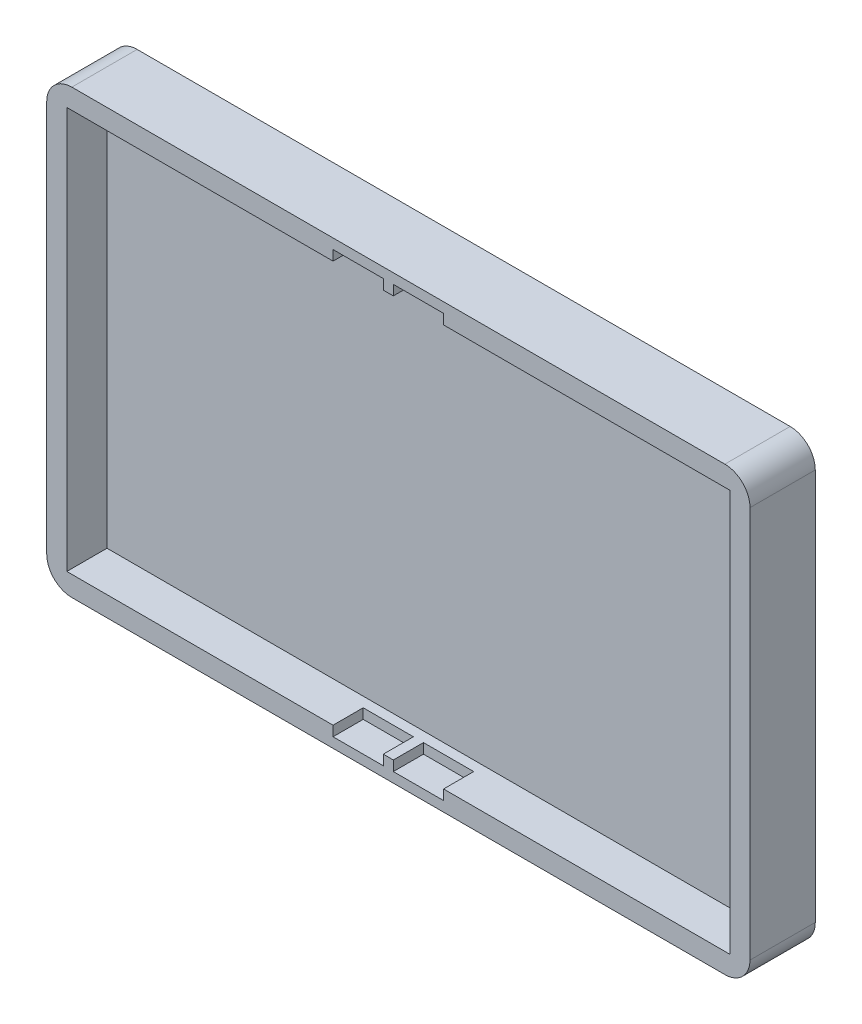
ISO-10303-21;
HEADER;
FILE_DESCRIPTION(('STEP AP214'),'2;1');
FILE_NAME('part.step','',(''),(''),'','','');
FILE_SCHEMA(('AUTOMOTIVE_DESIGN { 1 0 10303 214 1 1 1 1 }'));
ENDSEC;
DATA;
#1=APPLICATION_CONTEXT('core data for automotive mechanical design processes');
#2=APPLICATION_PROTOCOL_DEFINITION('international standard','automotive_design',2000,#1);
#3=PRODUCT_CONTEXT('',#1,'mechanical');
#4=PRODUCT('Part','Part','',(#3));
#5=PRODUCT_RELATED_PRODUCT_CATEGORY('part','',(#4));
#6=PRODUCT_DEFINITION_FORMATION('','',#4);
#7=PRODUCT_DEFINITION_CONTEXT('part definition',#1,'design');
#8=PRODUCT_DEFINITION('design','',#6,#7);
#9=PRODUCT_DEFINITION_SHAPE('','',#8);
#10=(LENGTH_UNIT() NAMED_UNIT(*) SI_UNIT(.MILLI.,.METRE.));
#11=(NAMED_UNIT(*) PLANE_ANGLE_UNIT() SI_UNIT($,.RADIAN.));
#12=(NAMED_UNIT(*) SI_UNIT($,.STERADIAN.) SOLID_ANGLE_UNIT());
#13=UNCERTAINTY_MEASURE_WITH_UNIT(LENGTH_MEASURE(1.E-05),#10,'distance_accuracy_value','');
#14=(GEOMETRIC_REPRESENTATION_CONTEXT(3) GLOBAL_UNCERTAINTY_ASSIGNED_CONTEXT((#13)) GLOBAL_UNIT_ASSIGNED_CONTEXT((#10,
#11,#12)) REPRESENTATION_CONTEXT('',''));
#15=CARTESIAN_POINT('',(0.,0.,0.));
#16=DIRECTION('',(0.,0.,1.));
#17=DIRECTION('',(1.,0.,0.));
#18=AXIS2_PLACEMENT_3D('',#15,#16,#17);
#19=CARTESIAN_POINT('',(68.,2.,2.5));
#20=DIRECTION('',(0.,-1.,0.));
#21=DIRECTION('',(1.,0.,0.));
#22=AXIS2_PLACEMENT_3D('',#19,#20,#21);
#23=PLANE('',#22);
#24=DIRECTION('',(1.,0.,0.));
#25=VECTOR('',#24,1.);
#26=CARTESIAN_POINT('',(68.,2.,6.5));
#27=LINE('',#26,#25);
#28=CARTESIAN_POINT('',(33.5,2.,6.5));
#29=VERTEX_POINT('',#28);
#30=CARTESIAN_POINT('',(34.5,2.,6.5));
#31=VERTEX_POINT('',#30);
#32=EDGE_CURVE('E406',#29,#31,#27,.T.);
#33=ORIENTED_EDGE('',*,*,#32,.T.);
#34=DIRECTION('',(0.,0.,1.));
#35=VECTOR('',#34,1.);
#36=CARTESIAN_POINT('',(34.5,2.,2.5));
#37=LINE('',#36,#35);
#38=CARTESIAN_POINT('',(34.5,2.,3.5));
#39=VERTEX_POINT('',#38);
#40=EDGE_CURVE('E358',#39,#31,#37,.T.);
#41=ORIENTED_EDGE('',*,*,#40,.F.);
#42=DIRECTION('',(-1.,0.,0.));
#43=VECTOR('',#42,1.);
#44=CARTESIAN_POINT('',(68.,2.,3.5));
#45=LINE('',#44,#43);
#46=CARTESIAN_POINT('',(39.5,2.,3.5));
#47=VERTEX_POINT('',#46);
#48=EDGE_CURVE('E355',#47,#39,#45,.T.);
#49=ORIENTED_EDGE('',*,*,#48,.F.);
#50=DIRECTION('',(0.,0.,-1.));
#51=VECTOR('',#50,1.);
#52=CARTESIAN_POINT('',(39.5,2.,2.5));
#53=LINE('',#52,#51);
#54=CARTESIAN_POINT('',(39.5,2.,6.5));
#55=VERTEX_POINT('',#54);
#56=EDGE_CURVE('E324',#55,#47,#53,.T.);
#57=ORIENTED_EDGE('',*,*,#56,.F.);
#58=CARTESIAN_POINT('',(68.,2.,6.5));
#59=VERTEX_POINT('',#58);
#60=EDGE_CURVE('E402',#55,#59,#27,.T.);
#61=ORIENTED_EDGE('',*,*,#60,.T.);
#62=DIRECTION('',(0.,0.,1.));
#63=VECTOR('',#62,1.);
#64=CARTESIAN_POINT('',(68.,2.,2.5));
#65=LINE('',#64,#63);
#66=CARTESIAN_POINT('',(68.,2.,2.5));
#67=VERTEX_POINT('',#66);
#68=EDGE_CURVE('E407',#67,#59,#65,.T.);
#69=ORIENTED_EDGE('',*,*,#68,.F.);
#70=DIRECTION('',(1.,0.,0.));
#71=VECTOR('',#70,1.);
#72=CARTESIAN_POINT('',(68.,2.,2.5));
#73=LINE('',#72,#71);
#74=CARTESIAN_POINT('',(2.,1.99999999999999,2.5));
#75=VERTEX_POINT('',#74);
#76=EDGE_CURVE('E385',#75,#67,#73,.T.);
#77=ORIENTED_EDGE('',*,*,#76,.F.);
#78=DIRECTION('',(0.,0.,1.));
#79=VECTOR('',#78,1.);
#80=CARTESIAN_POINT('',(2.,1.99999999999999,2.5));
#81=LINE('',#80,#79);
#82=CARTESIAN_POINT('',(2.,1.99999999999999,6.5));
#83=VERTEX_POINT('',#82);
#84=EDGE_CURVE('E412',#75,#83,#81,.T.);
#85=ORIENTED_EDGE('',*,*,#84,.T.);
#86=CARTESIAN_POINT('',(28.5,2.,6.5));
#87=VERTEX_POINT('',#86);
#88=EDGE_CURVE('E377',#83,#87,#27,.T.);
#89=ORIENTED_EDGE('',*,*,#88,.T.);
#90=DIRECTION('',(0.,0.,1.));
#91=VECTOR('',#90,1.);
#92=CARTESIAN_POINT('',(28.5,2.,2.5));
#93=LINE('',#92,#91);
#94=CARTESIAN_POINT('',(28.5,2.,3.5));
#95=VERTEX_POINT('',#94);
#96=EDGE_CURVE('E364',#95,#87,#93,.T.);
#97=ORIENTED_EDGE('',*,*,#96,.F.);
#98=DIRECTION('',(-1.,0.,0.));
#99=VECTOR('',#98,1.);
#100=CARTESIAN_POINT('',(68.,2.,3.50000000000001));
#101=LINE('',#100,#99);
#102=CARTESIAN_POINT('',(33.5,2.,3.5));
#103=VERTEX_POINT('',#102);
#104=EDGE_CURVE('E361',#103,#95,#101,.T.);
#105=ORIENTED_EDGE('',*,*,#104,.F.);
#106=DIRECTION('',(0.,0.,-1.));
#107=VECTOR('',#106,1.);
#108=CARTESIAN_POINT('',(33.5,2.,2.5));
#109=LINE('',#108,#107);
#110=EDGE_CURVE('E367',#29,#103,#109,.T.);
#111=ORIENTED_EDGE('',*,*,#110,.F.);
#112=EDGE_LOOP('',(#33,#41,#49,#57,#61,#69,#77,#85,#89,#97,#105,#111));
#113=FACE_BOUND('',#112,.T.);
#114=ADVANCED_FACE('F43',(#113),#23,.F.);
#115=CARTESIAN_POINT('',(68.,42.,2.5));
#116=DIRECTION('',(0.,1.,0.));
#117=DIRECTION('',(-1.,0.,0.));
#118=AXIS2_PLACEMENT_3D('',#115,#116,#117);
#119=PLANE('',#118);
#120=DIRECTION('',(0.,0.,-1.));
#121=VECTOR('',#120,1.);
#122=CARTESIAN_POINT('',(28.5,42.,2.5));
#123=LINE('',#122,#121);
#124=CARTESIAN_POINT('',(28.5,42.,6.5));
#125=VERTEX_POINT('',#124);
#126=CARTESIAN_POINT('',(28.5,42.,3.5));
#127=VERTEX_POINT('',#126);
#128=EDGE_CURVE('E463',#125,#127,#123,.T.);
#129=ORIENTED_EDGE('',*,*,#128,.F.);
#130=DIRECTION('',(-1.,0.,0.));
#131=VECTOR('',#130,1.);
#132=CARTESIAN_POINT('',(68.,42.,6.5));
#133=LINE('',#132,#131);
#134=CARTESIAN_POINT('',(2.,42.,6.5));
#135=VERTEX_POINT('',#134);
#136=EDGE_CURVE('E392',#125,#135,#133,.T.);
#137=ORIENTED_EDGE('',*,*,#136,.T.);
#138=DIRECTION('',(0.,0.,1.));
#139=VECTOR('',#138,1.);
#140=CARTESIAN_POINT('',(2.,42.,2.5));
#141=LINE('',#140,#139);
#142=CARTESIAN_POINT('',(2.,42.,2.5));
#143=VERTEX_POINT('',#142);
#144=EDGE_CURVE('E415',#143,#135,#141,.T.);
#145=ORIENTED_EDGE('',*,*,#144,.F.);
#146=DIRECTION('',(-1.,0.,0.));
#147=VECTOR('',#146,1.);
#148=CARTESIAN_POINT('',(68.,42.,2.5));
#149=LINE('',#148,#147);
#150=CARTESIAN_POINT('',(68.,42.,2.5));
#151=VERTEX_POINT('',#150);
#152=EDGE_CURVE('E376',#151,#143,#149,.T.);
#153=ORIENTED_EDGE('',*,*,#152,.F.);
#154=DIRECTION('',(0.,0.,1.));
#155=VECTOR('',#154,1.);
#156=CARTESIAN_POINT('',(68.,42.,2.5));
#157=LINE('',#156,#155);
#158=CARTESIAN_POINT('',(68.,42.,6.5));
#159=VERTEX_POINT('',#158);
#160=EDGE_CURVE('E389',#151,#159,#157,.T.);
#161=ORIENTED_EDGE('',*,*,#160,.T.);
#162=CARTESIAN_POINT('',(39.5,42.,6.5));
#163=VERTEX_POINT('',#162);
#164=EDGE_CURVE('E393',#159,#163,#133,.T.);
#165=ORIENTED_EDGE('',*,*,#164,.T.);
#166=DIRECTION('',(0.,0.,1.));
#167=VECTOR('',#166,1.);
#168=CARTESIAN_POINT('',(39.5,42.,2.5));
#169=LINE('',#168,#167);
#170=CARTESIAN_POINT('',(39.5,42.,3.5));
#171=VERTEX_POINT('',#170);
#172=EDGE_CURVE('E437',#171,#163,#169,.T.);
#173=ORIENTED_EDGE('',*,*,#172,.F.);
#174=DIRECTION('',(1.,0.,0.));
#175=VECTOR('',#174,1.);
#176=CARTESIAN_POINT('',(68.,42.,3.5));
#177=LINE('',#176,#175);
#178=CARTESIAN_POINT('',(34.5,42.,3.5));
#179=VERTEX_POINT('',#178);
#180=EDGE_CURVE('E453',#179,#171,#177,.T.);
#181=ORIENTED_EDGE('',*,*,#180,.F.);
#182=DIRECTION('',(0.,0.,-1.));
#183=VECTOR('',#182,1.);
#184=CARTESIAN_POINT('',(34.5,42.,2.5));
#185=LINE('',#184,#183);
#186=CARTESIAN_POINT('',(34.5,42.,6.5));
#187=VERTEX_POINT('',#186);
#188=EDGE_CURVE('E457',#187,#179,#185,.T.);
#189=ORIENTED_EDGE('',*,*,#188,.F.);
#190=CARTESIAN_POINT('',(33.5,42.,6.5));
#191=VERTEX_POINT('',#190);
#192=EDGE_CURVE('E398',#187,#191,#133,.T.);
#193=ORIENTED_EDGE('',*,*,#192,.T.);
#194=DIRECTION('',(0.,0.,1.));
#195=VECTOR('',#194,1.);
#196=CARTESIAN_POINT('',(33.5,42.,2.5));
#197=LINE('',#196,#195);
#198=CARTESIAN_POINT('',(33.5,42.,3.5));
#199=VERTEX_POINT('',#198);
#200=EDGE_CURVE('E250',#199,#191,#197,.T.);
#201=ORIENTED_EDGE('',*,*,#200,.F.);
#202=DIRECTION('',(1.,0.,0.));
#203=VECTOR('',#202,1.);
#204=CARTESIAN_POINT('',(68.,42.,3.50000000000001));
#205=LINE('',#204,#203);
#206=EDGE_CURVE('E460',#127,#199,#205,.T.);
#207=ORIENTED_EDGE('',*,*,#206,.F.);
#208=EDGE_LOOP('',(#129,#137,#145,#153,#161,#165,#173,#181,#189,#193,#201,#207));
#209=FACE_BOUND('',#208,.T.);
#210=ADVANCED_FACE('F536',(#209),#119,.F.);
#211=CARTESIAN_POINT('',(0.,0.,6.5));
#212=DIRECTION('',(1.,0.,0.));
#213=DIRECTION('',(0.,0.,-1.));
#214=AXIS2_PLACEMENT_3D('',#211,#212,#213);
#215=PLANE('',#214);
#216=DIRECTION('',(0.,-1.,0.));
#217=VECTOR('',#216,1.);
#218=CARTESIAN_POINT('',(0.,0.,6.5));
#219=LINE('',#218,#217);
#220=CARTESIAN_POINT('',(0.,41.5,6.5));
#221=VERTEX_POINT('',#220);
#222=CARTESIAN_POINT('',(0.,2.5,6.5));
#223=VERTEX_POINT('',#222);
#224=EDGE_CURVE('E422',#221,#223,#219,.T.);
#225=ORIENTED_EDGE('',*,*,#224,.F.);
#226=DIRECTION('',(0.,0.,-1.));
#227=VECTOR('',#226,1.);
#228=CARTESIAN_POINT('',(0.,41.5,6.5));
#229=LINE('',#228,#227);
#230=CARTESIAN_POINT('',(0.,41.5,0.));
#231=VERTEX_POINT('',#230);
#232=EDGE_CURVE('E472',#221,#231,#229,.T.);
#233=ORIENTED_EDGE('',*,*,#232,.T.);
#234=DIRECTION('',(0.,-1.,0.));
#235=VECTOR('',#234,1.);
#236=CARTESIAN_POINT('',(0.,0.,0.));
#237=LINE('',#236,#235);
#238=CARTESIAN_POINT('',(0.,2.5,0.));
#239=VERTEX_POINT('',#238);
#240=EDGE_CURVE('E411',#231,#239,#237,.T.);
#241=ORIENTED_EDGE('',*,*,#240,.T.);
#242=DIRECTION('',(0.,0.,-1.));
#243=VECTOR('',#242,1.);
#244=CARTESIAN_POINT('',(0.,2.5,6.5));
#245=LINE('',#244,#243);
#246=EDGE_CURVE('E469',#239,#223,#245,.F.);
#247=ORIENTED_EDGE('',*,*,#246,.T.);
#248=EDGE_LOOP('',(#225,#233,#241,#247));
#249=FACE_BOUND('',#248,.T.);
#250=ADVANCED_FACE('F606',(#249),#215,.F.);
#251=CARTESIAN_POINT('',(0.,0.,6.5));
#252=DIRECTION('',(0.,1.,0.));
#253=DIRECTION('',(0.,0.,1.));
#254=AXIS2_PLACEMENT_3D('',#251,#252,#253);
#255=PLANE('',#254);
#256=DIRECTION('',(1.,0.,0.));
#257=VECTOR('',#256,1.);
#258=CARTESIAN_POINT('',(0.,0.,6.5));
#259=LINE('',#258,#257);
#260=CARTESIAN_POINT('',(2.5,0.,6.5));
#261=VERTEX_POINT('',#260);
#262=CARTESIAN_POINT('',(67.5,0.,6.5));
#263=VERTEX_POINT('',#262);
#264=EDGE_CURVE('E426',#261,#263,#259,.T.);
#265=ORIENTED_EDGE('',*,*,#264,.F.);
#266=DIRECTION('',(0.,0.,-1.));
#267=VECTOR('',#266,1.);
#268=CARTESIAN_POINT('',(2.5,0.,6.5));
#269=LINE('',#268,#267);
#270=CARTESIAN_POINT('',(2.5,0.,0.));
#271=VERTEX_POINT('',#270);
#272=EDGE_CURVE('E509',#261,#271,#269,.T.);
#273=ORIENTED_EDGE('',*,*,#272,.T.);
#274=DIRECTION('',(1.,0.,0.));
#275=VECTOR('',#274,1.);
#276=CARTESIAN_POINT('',(0.,0.,0.));
#277=LINE('',#276,#275);
#278=CARTESIAN_POINT('',(67.5,0.,0.));
#279=VERTEX_POINT('',#278);
#280=EDGE_CURVE('E441',#271,#279,#277,.T.);
#281=ORIENTED_EDGE('',*,*,#280,.T.);
#282=DIRECTION('',(0.,0.,-1.));
#283=VECTOR('',#282,1.);
#284=CARTESIAN_POINT('',(67.5,0.,6.5));
#285=LINE('',#284,#283);
#286=EDGE_CURVE('E506',#279,#263,#285,.F.);
#287=ORIENTED_EDGE('',*,*,#286,.T.);
#288=EDGE_LOOP('',(#265,#273,#281,#287));
#289=FACE_BOUND('',#288,.T.);
#290=ADVANCED_FACE('F630',(#289),#255,.F.);
#291=CARTESIAN_POINT('',(70.,0.,6.5));
#292=DIRECTION('',(-1.,0.,0.));
#293=DIRECTION('',(0.,0.,1.));
#294=AXIS2_PLACEMENT_3D('',#291,#292,#293);
#295=PLANE('',#294);
#296=DIRECTION('',(0.,1.,0.));
#297=VECTOR('',#296,1.);
#298=CARTESIAN_POINT('',(70.,0.,6.5));
#299=LINE('',#298,#297);
#300=CARTESIAN_POINT('',(70.,2.5,6.5));
#301=VERTEX_POINT('',#300);
#302=CARTESIAN_POINT('',(70.,41.5,6.5));
#303=VERTEX_POINT('',#302);
#304=EDGE_CURVE('E430',#301,#303,#299,.T.);
#305=ORIENTED_EDGE('',*,*,#304,.F.);
#306=DIRECTION('',(0.,0.,-1.));
#307=VECTOR('',#306,1.);
#308=CARTESIAN_POINT('',(70.,2.5,6.5));
#309=LINE('',#308,#307);
#310=CARTESIAN_POINT('',(70.,2.5,0.));
#311=VERTEX_POINT('',#310);
#312=EDGE_CURVE('E11',#301,#311,#309,.T.);
#313=ORIENTED_EDGE('',*,*,#312,.T.);
#314=DIRECTION('',(0.,1.,0.));
#315=VECTOR('',#314,1.);
#316=CARTESIAN_POINT('',(70.,0.,0.));
#317=LINE('',#316,#315);
#318=CARTESIAN_POINT('',(70.,41.5,0.));
#319=VERTEX_POINT('',#318);
#320=EDGE_CURVE('E445',#311,#319,#317,.T.);
#321=ORIENTED_EDGE('',*,*,#320,.T.);
#322=DIRECTION('',(0.,0.,-1.));
#323=VECTOR('',#322,1.);
#324=CARTESIAN_POINT('',(70.,41.5,6.5));
#325=LINE('',#324,#323);
#326=EDGE_CURVE('E52',#319,#303,#325,.F.);
#327=ORIENTED_EDGE('',*,*,#326,.T.);
#328=EDGE_LOOP('',(#305,#313,#321,#327));
#329=FACE_BOUND('',#328,.T.);
#330=ADVANCED_FACE('F626',(#329),#295,.F.);
#331=CARTESIAN_POINT('',(0.,44.,6.5));
#332=DIRECTION('',(0.,-1.,0.));
#333=DIRECTION('',(0.,0.,-1.));
#334=AXIS2_PLACEMENT_3D('',#331,#332,#333);
#335=PLANE('',#334);
#336=DIRECTION('',(-1.,0.,0.));
#337=VECTOR('',#336,1.);
#338=CARTESIAN_POINT('',(0.,44.,0.));
#339=LINE('',#338,#337);
#340=CARTESIAN_POINT('',(67.5,44.,0.));
#341=VERTEX_POINT('',#340);
#342=CARTESIAN_POINT('',(2.5,44.,0.));
#343=VERTEX_POINT('',#342);
#344=EDGE_CURVE('E427',#341,#343,#339,.T.);
#345=ORIENTED_EDGE('',*,*,#344,.T.);
#346=DIRECTION('',(0.,0.,-1.));
#347=VECTOR('',#346,1.);
#348=CARTESIAN_POINT('',(2.5,44.,6.5));
#349=LINE('',#348,#347);
#350=CARTESIAN_POINT('',(2.5,44.,6.5));
#351=VERTEX_POINT('',#350);
#352=EDGE_CURVE('E492',#343,#351,#349,.F.);
#353=ORIENTED_EDGE('',*,*,#352,.T.);
#354=DIRECTION('',(-1.,0.,0.));
#355=VECTOR('',#354,1.);
#356=CARTESIAN_POINT('',(0.,44.,6.5));
#357=LINE('',#356,#355);
#358=CARTESIAN_POINT('',(67.5,44.,6.5));
#359=VERTEX_POINT('',#358);
#360=EDGE_CURVE('E433',#359,#351,#357,.T.);
#361=ORIENTED_EDGE('',*,*,#360,.F.);
#362=DIRECTION('',(0.,0.,-1.));
#363=VECTOR('',#362,1.);
#364=CARTESIAN_POINT('',(67.5,44.,6.5));
#365=LINE('',#364,#363);
#366=EDGE_CURVE('E488',#359,#341,#365,.T.);
#367=ORIENTED_EDGE('',*,*,#366,.T.);
#368=EDGE_LOOP('',(#345,#353,#361,#367));
#369=FACE_BOUND('',#368,.T.);
#370=ADVANCED_FACE('F620',(#369),#335,.F.);
#371=CARTESIAN_POINT('',(0.,0.,6.5));
#372=DIRECTION('',(0.,0.,-1.));
#373=DIRECTION('',(-1.,0.,0.));
#374=AXIS2_PLACEMENT_3D('',#371,#372,#373);
#375=PLANE('',#374);
#376=ORIENTED_EDGE('',*,*,#136,.F.);
#377=DIRECTION('',(0.,-1.,0.));
#378=VECTOR('',#377,1.);
#379=CARTESIAN_POINT('',(28.5,43.,6.5));
#380=LINE('',#379,#378);
#381=CARTESIAN_POINT('',(28.5,43.,6.5));
#382=VERTEX_POINT('',#381);
#383=EDGE_CURVE('E255',#382,#125,#380,.T.);
#384=ORIENTED_EDGE('',*,*,#383,.F.);
#385=DIRECTION('',(-1.,0.,0.));
#386=VECTOR('',#385,1.);
#387=CARTESIAN_POINT('',(28.5,43.,6.5));
#388=LINE('',#387,#386);
#389=CARTESIAN_POINT('',(33.5,43.,6.5));
#390=VERTEX_POINT('',#389);
#391=EDGE_CURVE('E236',#390,#382,#388,.T.);
#392=ORIENTED_EDGE('',*,*,#391,.F.);
#393=DIRECTION('',(0.,-1.,0.));
#394=VECTOR('',#393,1.);
#395=CARTESIAN_POINT('',(33.5,43.,6.5));
#396=LINE('',#395,#394);
#397=EDGE_CURVE('E247',#390,#191,#396,.T.);
#398=ORIENTED_EDGE('',*,*,#397,.T.);
#399=ORIENTED_EDGE('',*,*,#192,.F.);
#400=DIRECTION('',(0.,-1.,0.));
#401=VECTOR('',#400,1.);
#402=CARTESIAN_POINT('',(34.5,43.,6.5));
#403=LINE('',#402,#401);
#404=CARTESIAN_POINT('',(34.5,43.,6.5));
#405=VERTEX_POINT('',#404);
#406=EDGE_CURVE('E282',#405,#187,#403,.T.);
#407=ORIENTED_EDGE('',*,*,#406,.F.);
#408=DIRECTION('',(-1.,0.,0.));
#409=VECTOR('',#408,1.);
#410=CARTESIAN_POINT('',(39.5,43.,6.5));
#411=LINE('',#410,#409);
#412=CARTESIAN_POINT('',(39.5,43.,6.5));
#413=VERTEX_POINT('',#412);
#414=EDGE_CURVE('E274',#413,#405,#411,.T.);
#415=ORIENTED_EDGE('',*,*,#414,.F.);
#416=DIRECTION('',(0.,-1.,0.));
#417=VECTOR('',#416,1.);
#418=CARTESIAN_POINT('',(39.5,43.,6.5));
#419=LINE('',#418,#417);
#420=EDGE_CURVE('E281',#413,#163,#419,.T.);
#421=ORIENTED_EDGE('',*,*,#420,.T.);
#422=ORIENTED_EDGE('',*,*,#164,.F.);
#423=DIRECTION('',(0.,1.,0.));
#424=VECTOR('',#423,1.);
#425=CARTESIAN_POINT('',(68.,42.,6.5));
#426=LINE('',#425,#424);
#427=EDGE_CURVE('E371',#59,#159,#426,.T.);
#428=ORIENTED_EDGE('',*,*,#427,.F.);
#429=ORIENTED_EDGE('',*,*,#60,.F.);
#430=DIRECTION('',(0.,1.,0.));
#431=VECTOR('',#430,1.);
#432=CARTESIAN_POINT('',(39.5,0.999999999999997,6.5));
#433=LINE('',#432,#431);
#434=CARTESIAN_POINT('',(39.5,0.999999999999997,6.5));
#435=VERTEX_POINT('',#434);
#436=EDGE_CURVE('E270',#435,#55,#433,.T.);
#437=ORIENTED_EDGE('',*,*,#436,.F.);
#438=DIRECTION('',(1.,0.,0.));
#439=VECTOR('',#438,1.);
#440=CARTESIAN_POINT('',(34.5,0.999999999999996,6.5));
#441=LINE('',#440,#439);
#442=CARTESIAN_POINT('',(34.5,0.999999999999996,6.5));
#443=VERTEX_POINT('',#442);
#444=EDGE_CURVE('E264',#443,#435,#441,.T.);
#445=ORIENTED_EDGE('',*,*,#444,.F.);
#446=DIRECTION('',(0.,1.,0.));
#447=VECTOR('',#446,1.);
#448=CARTESIAN_POINT('',(34.5,0.999999999999996,6.5));
#449=LINE('',#448,#447);
#450=EDGE_CURVE('E269',#443,#31,#449,.T.);
#451=ORIENTED_EDGE('',*,*,#450,.T.);
#452=ORIENTED_EDGE('',*,*,#32,.F.);
#453=DIRECTION('',(0.,1.,0.));
#454=VECTOR('',#453,1.);
#455=CARTESIAN_POINT('',(33.5,0.999999999999996,6.5));
#456=LINE('',#455,#454);
#457=CARTESIAN_POINT('',(33.5,0.999999999999996,6.5));
#458=VERTEX_POINT('',#457);
#459=EDGE_CURVE('E294',#458,#29,#456,.T.);
#460=ORIENTED_EDGE('',*,*,#459,.F.);
#461=DIRECTION('',(1.,0.,0.));
#462=VECTOR('',#461,1.);
#463=CARTESIAN_POINT('',(28.5,0.999999999999995,6.5));
#464=LINE('',#463,#462);
#465=CARTESIAN_POINT('',(28.5,0.999999999999995,6.5));
#466=VERTEX_POINT('',#465);
#467=EDGE_CURVE('E286',#466,#458,#464,.T.);
#468=ORIENTED_EDGE('',*,*,#467,.F.);
#469=DIRECTION('',(0.,1.,0.));
#470=VECTOR('',#469,1.);
#471=CARTESIAN_POINT('',(28.5,0.999999999999995,6.5));
#472=LINE('',#471,#470);
#473=EDGE_CURVE('E293',#466,#87,#472,.T.);
#474=ORIENTED_EDGE('',*,*,#473,.T.);
#475=ORIENTED_EDGE('',*,*,#88,.F.);
#476=DIRECTION('',(0.,-1.,0.));
#477=VECTOR('',#476,1.);
#478=CARTESIAN_POINT('',(2.,42.,6.5));
#479=LINE('',#478,#477);
#480=EDGE_CURVE('E397',#135,#83,#479,.T.);
#481=ORIENTED_EDGE('',*,*,#480,.F.);
#482=EDGE_LOOP('',(#376,#384,#392,#398,#399,#407,#415,#421,#422,#428,#429,#437,#445,#451,#452,
#460,#468,#474,#475,#481));
#483=FACE_BOUND('',#482,.T.);
#484=ORIENTED_EDGE('',*,*,#360,.T.);
#485=CARTESIAN_POINT('',(2.5,41.5,6.5));
#486=DIRECTION('',(0.,0.,-1.));
#487=DIRECTION('',(-1.,0.,0.));
#488=AXIS2_PLACEMENT_3D('',#485,#486,#487);
#489=CIRCLE('',#488,2.5);
#490=EDGE_CURVE('E503',#351,#221,#489,.F.);
#491=ORIENTED_EDGE('',*,*,#490,.T.);
#492=ORIENTED_EDGE('',*,*,#224,.T.);
#493=CARTESIAN_POINT('',(2.5,2.5,6.5));
#494=DIRECTION('',(0.,0.,-1.));
#495=DIRECTION('',(-1.,0.,0.));
#496=AXIS2_PLACEMENT_3D('',#493,#494,#495);
#497=CIRCLE('',#496,2.5);
#498=EDGE_CURVE('E500',#223,#261,#497,.F.);
#499=ORIENTED_EDGE('',*,*,#498,.T.);
#500=ORIENTED_EDGE('',*,*,#264,.T.);
#501=CARTESIAN_POINT('',(67.5,2.5,6.5));
#502=DIRECTION('',(0.,0.,-1.));
#503=DIRECTION('',(-1.,0.,0.));
#504=AXIS2_PLACEMENT_3D('',#501,#502,#503);
#505=CIRCLE('',#504,2.5);
#506=EDGE_CURVE('E65',#263,#301,#505,.F.);
#507=ORIENTED_EDGE('',*,*,#506,.T.);
#508=ORIENTED_EDGE('',*,*,#304,.T.);
#509=CARTESIAN_POINT('',(67.5,41.5,6.5));
#510=DIRECTION('',(0.,0.,-1.));
#511=DIRECTION('',(-1.,0.,0.));
#512=AXIS2_PLACEMENT_3D('',#509,#510,#511);
#513=CIRCLE('',#512,2.5);
#514=EDGE_CURVE('E495',#303,#359,#513,.F.);
#515=ORIENTED_EDGE('',*,*,#514,.T.);
#516=EDGE_LOOP('',(#484,#491,#492,#499,#500,#507,#508,#515));
#517=FACE_BOUND('',#516,.T.);
#518=ADVANCED_FACE('F258',(#483,#517),#375,.F.);
#519=CARTESIAN_POINT('',(0.,0.,0.));
#520=DIRECTION('',(0.,0.,-1.));
#521=DIRECTION('',(-1.,0.,0.));
#522=AXIS2_PLACEMENT_3D('',#519,#520,#521);
#523=PLANE('',#522);
#524=ORIENTED_EDGE('',*,*,#240,.F.);
#525=CARTESIAN_POINT('',(2.5,41.5,0.));
#526=DIRECTION('',(0.,0.,-1.));
#527=DIRECTION('',(-1.,0.,0.));
#528=AXIS2_PLACEMENT_3D('',#525,#526,#527);
#529=CIRCLE('',#528,2.5);
#530=EDGE_CURVE('E485',#231,#343,#529,.T.);
#531=ORIENTED_EDGE('',*,*,#530,.T.);
#532=ORIENTED_EDGE('',*,*,#344,.F.);
#533=CARTESIAN_POINT('',(67.5,41.5,0.));
#534=DIRECTION('',(0.,0.,-1.));
#535=DIRECTION('',(-1.,0.,0.));
#536=AXIS2_PLACEMENT_3D('',#533,#534,#535);
#537=CIRCLE('',#536,2.5);
#538=EDGE_CURVE('E476',#341,#319,#537,.T.);
#539=ORIENTED_EDGE('',*,*,#538,.T.);
#540=ORIENTED_EDGE('',*,*,#320,.F.);
#541=CARTESIAN_POINT('',(67.5,2.5,0.));
#542=DIRECTION('',(0.,0.,-1.));
#543=DIRECTION('',(-1.,0.,0.));
#544=AXIS2_PLACEMENT_3D('',#541,#542,#543);
#545=CIRCLE('',#544,2.5);
#546=EDGE_CURVE('E479',#311,#279,#545,.T.);
#547=ORIENTED_EDGE('',*,*,#546,.T.);
#548=ORIENTED_EDGE('',*,*,#280,.F.);
#549=CARTESIAN_POINT('',(2.5,2.5,0.));
#550=DIRECTION('',(0.,0.,-1.));
#551=DIRECTION('',(-1.,0.,0.));
#552=AXIS2_PLACEMENT_3D('',#549,#550,#551);
#553=CIRCLE('',#552,2.5);
#554=EDGE_CURVE('E482',#271,#239,#553,.T.);
#555=ORIENTED_EDGE('',*,*,#554,.T.);
#556=EDGE_LOOP('',(#524,#531,#532,#539,#540,#547,#548,#555));
#557=FACE_BOUND('',#556,.T.);
#558=ADVANCED_FACE('F617',(#557),#523,.T.);
#559=CARTESIAN_POINT('',(68.,42.,2.5));
#560=DIRECTION('',(1.,0.,0.));
#561=DIRECTION('',(0.,0.,-1.));
#562=AXIS2_PLACEMENT_3D('',#559,#560,#561);
#563=PLANE('',#562);
#564=ORIENTED_EDGE('',*,*,#427,.T.);
#565=ORIENTED_EDGE('',*,*,#160,.F.);
#566=DIRECTION('',(0.,1.,0.));
#567=VECTOR('',#566,1.);
#568=CARTESIAN_POINT('',(68.,42.,2.5));
#569=LINE('',#568,#567);
#570=EDGE_CURVE('E372',#67,#151,#569,.T.);
#571=ORIENTED_EDGE('',*,*,#570,.F.);
#572=ORIENTED_EDGE('',*,*,#68,.T.);
#573=EDGE_LOOP('',(#564,#565,#571,#572));
#574=FACE_BOUND('',#573,.T.);
#575=ADVANCED_FACE('F546',(#574),#563,.F.);
#576=CARTESIAN_POINT('',(2.,42.,2.5));
#577=DIRECTION('',(-1.,0.,0.));
#578=DIRECTION('',(0.,0.,1.));
#579=AXIS2_PLACEMENT_3D('',#576,#577,#578);
#580=PLANE('',#579);
#581=ORIENTED_EDGE('',*,*,#480,.T.);
#582=ORIENTED_EDGE('',*,*,#84,.F.);
#583=DIRECTION('',(0.,-1.,0.));
#584=VECTOR('',#583,1.);
#585=CARTESIAN_POINT('',(2.,42.,2.5));
#586=LINE('',#585,#584);
#587=EDGE_CURVE('E381',#143,#75,#586,.T.);
#588=ORIENTED_EDGE('',*,*,#587,.F.);
#589=ORIENTED_EDGE('',*,*,#144,.T.);
#590=EDGE_LOOP('',(#581,#582,#588,#589));
#591=FACE_BOUND('',#590,.T.);
#592=ADVANCED_FACE('F611',(#591),#580,.F.);
#593=CARTESIAN_POINT('',(0.,0.,2.5));
#594=DIRECTION('',(0.,0.,-1.));
#595=DIRECTION('',(-1.,0.,0.));
#596=AXIS2_PLACEMENT_3D('',#593,#594,#595);
#597=PLANE('',#596);
#598=ORIENTED_EDGE('',*,*,#570,.T.);
#599=ORIENTED_EDGE('',*,*,#152,.T.);
#600=ORIENTED_EDGE('',*,*,#587,.T.);
#601=ORIENTED_EDGE('',*,*,#76,.T.);
#602=EDGE_LOOP('',(#598,#599,#600,#601));
#603=FACE_BOUND('',#602,.T.);
#604=ADVANCED_FACE('F551',(#603),#597,.F.);
#605=CARTESIAN_POINT('',(0.,43.,0.));
#606=DIRECTION('',(0.,-1.,0.));
#607=DIRECTION('',(0.,0.,-1.));
#608=AXIS2_PLACEMENT_3D('',#605,#606,#607);
#609=PLANE('',#608);
#610=DIRECTION('',(0.,0.,1.));
#611=VECTOR('',#610,1.);
#612=CARTESIAN_POINT('',(39.5,43.,5.5));
#613=LINE('',#612,#611);
#614=CARTESIAN_POINT('',(39.5,43.,3.5));
#615=VERTEX_POINT('',#614);
#616=EDGE_CURVE('E343',#615,#413,#613,.T.);
#617=ORIENTED_EDGE('',*,*,#616,.T.);
#618=ORIENTED_EDGE('',*,*,#414,.T.);
#619=DIRECTION('',(0.,0.,-1.));
#620=VECTOR('',#619,1.);
#621=CARTESIAN_POINT('',(34.5,43.,5.5));
#622=LINE('',#621,#620);
#623=CARTESIAN_POINT('',(34.5,43.,3.5));
#624=VERTEX_POINT('',#623);
#625=EDGE_CURVE('E244',#405,#624,#622,.T.);
#626=ORIENTED_EDGE('',*,*,#625,.T.);
#627=DIRECTION('',(1.,0.,0.));
#628=VECTOR('',#627,1.);
#629=CARTESIAN_POINT('',(39.5,43.,3.5));
#630=LINE('',#629,#628);
#631=EDGE_CURVE('E346',#624,#615,#630,.T.);
#632=ORIENTED_EDGE('',*,*,#631,.T.);
#633=EDGE_LOOP('',(#617,#618,#626,#632));
#634=FACE_BOUND('',#633,.T.);
#635=ADVANCED_FACE('F531',(#634),#609,.T.);
#636=CARTESIAN_POINT('',(39.5,0.999999999999973,5.5));
#637=DIRECTION('',(-1.,0.,0.));
#638=DIRECTION('',(0.,-1.,0.));
#639=AXIS2_PLACEMENT_3D('',#636,#637,#638);
#640=PLANE('',#639);
#641=ORIENTED_EDGE('',*,*,#172,.T.);
#642=ORIENTED_EDGE('',*,*,#420,.F.);
#643=ORIENTED_EDGE('',*,*,#616,.F.);
#644=DIRECTION('',(0.,1.,0.));
#645=VECTOR('',#644,1.);
#646=CARTESIAN_POINT('',(39.5,0.999999999999973,3.5));
#647=LINE('',#646,#645);
#648=EDGE_CURVE('E329',#171,#615,#647,.T.);
#649=ORIENTED_EDGE('',*,*,#648,.F.);
#650=EDGE_LOOP('',(#641,#642,#643,#649));
#651=FACE_BOUND('',#650,.T.);
#652=ADVANCED_FACE('F541',(#651),#640,.T.);
#653=CARTESIAN_POINT('',(39.5,0.999999999999973,3.5));
#654=DIRECTION('',(0.,0.,1.));
#655=DIRECTION('',(1.,0.,0.));
#656=AXIS2_PLACEMENT_3D('',#653,#654,#655);
#657=PLANE('',#656);
#658=ORIENTED_EDGE('',*,*,#180,.T.);
#659=ORIENTED_EDGE('',*,*,#648,.T.);
#660=ORIENTED_EDGE('',*,*,#631,.F.);
#661=DIRECTION('',(0.,1.,0.));
#662=VECTOR('',#661,1.);
#663=CARTESIAN_POINT('',(34.5,0.999999999999973,3.5));
#664=LINE('',#663,#662);
#665=EDGE_CURVE('E298',#179,#624,#664,.T.);
#666=ORIENTED_EDGE('',*,*,#665,.F.);
#667=EDGE_LOOP('',(#658,#659,#660,#666));
#668=FACE_BOUND('',#667,.T.);
#669=ADVANCED_FACE('F528',(#668),#657,.T.);
#670=CARTESIAN_POINT('',(34.5,0.999999999999973,5.5));
#671=DIRECTION('',(1.,0.,0.));
#672=DIRECTION('',(0.,1.,0.));
#673=AXIS2_PLACEMENT_3D('',#670,#671,#672);
#674=PLANE('',#673);
#675=ORIENTED_EDGE('',*,*,#188,.T.);
#676=ORIENTED_EDGE('',*,*,#665,.T.);
#677=ORIENTED_EDGE('',*,*,#625,.F.);
#678=ORIENTED_EDGE('',*,*,#406,.T.);
#679=EDGE_LOOP('',(#675,#676,#677,#678));
#680=FACE_BOUND('',#679,.T.);
#681=ADVANCED_FACE('F525',(#680),#674,.T.);
#682=CARTESIAN_POINT('',(0.,43.,0.));
#683=DIRECTION('',(0.,1.,0.));
#684=DIRECTION('',(-1.,0.,0.));
#685=AXIS2_PLACEMENT_3D('',#682,#683,#684);
#686=PLANE('',#685);
#687=DIRECTION('',(0.,0.,1.));
#688=VECTOR('',#687,1.);
#689=CARTESIAN_POINT('',(33.5,43.,5.5));
#690=LINE('',#689,#688);
#691=CARTESIAN_POINT('',(33.5,43.,3.5));
#692=VERTEX_POINT('',#691);
#693=EDGE_CURVE('E231',#692,#390,#690,.T.);
#694=ORIENTED_EDGE('',*,*,#693,.T.);
#695=ORIENTED_EDGE('',*,*,#391,.T.);
#696=DIRECTION('',(0.,0.,-1.));
#697=VECTOR('',#696,1.);
#698=CARTESIAN_POINT('',(28.5,43.,5.5));
#699=LINE('',#698,#697);
#700=CARTESIAN_POINT('',(28.5,43.,3.5));
#701=VERTEX_POINT('',#700);
#702=EDGE_CURVE('E243',#382,#701,#699,.T.);
#703=ORIENTED_EDGE('',*,*,#702,.T.);
#704=DIRECTION('',(1.,0.,0.));
#705=VECTOR('',#704,1.);
#706=CARTESIAN_POINT('',(33.5,43.,3.5));
#707=LINE('',#706,#705);
#708=EDGE_CURVE('E239',#701,#692,#707,.T.);
#709=ORIENTED_EDGE('',*,*,#708,.T.);
#710=EDGE_LOOP('',(#694,#695,#703,#709));
#711=FACE_BOUND('',#710,.T.);
#712=ADVANCED_FACE('F233',(#711),#686,.F.);
#713=CARTESIAN_POINT('',(33.5,0.999999999999973,3.5));
#714=DIRECTION('',(0.,0.,1.));
#715=DIRECTION('',(1.,0.,0.));
#716=AXIS2_PLACEMENT_3D('',#713,#714,#715);
#717=PLANE('',#716);
#718=ORIENTED_EDGE('',*,*,#206,.T.);
#719=DIRECTION('',(0.,1.,0.));
#720=VECTOR('',#719,1.);
#721=CARTESIAN_POINT('',(33.5,0.999999999999973,3.5));
#722=LINE('',#721,#720);
#723=EDGE_CURVE('E315',#199,#692,#722,.T.);
#724=ORIENTED_EDGE('',*,*,#723,.T.);
#725=ORIENTED_EDGE('',*,*,#708,.F.);
#726=DIRECTION('',(0.,1.,0.));
#727=VECTOR('',#726,1.);
#728=CARTESIAN_POINT('',(28.5,0.999999999999966,3.5));
#729=LINE('',#728,#727);
#730=EDGE_CURVE('E319',#127,#701,#729,.T.);
#731=ORIENTED_EDGE('',*,*,#730,.F.);
#732=EDGE_LOOP('',(#718,#724,#725,#731));
#733=FACE_BOUND('',#732,.T.);
#734=ADVANCED_FACE('F590',(#733),#717,.T.);
#735=CARTESIAN_POINT('',(28.5,0.999999999999966,5.5));
#736=DIRECTION('',(1.,0.,0.));
#737=DIRECTION('',(0.,1.,0.));
#738=AXIS2_PLACEMENT_3D('',#735,#736,#737);
#739=PLANE('',#738);
#740=ORIENTED_EDGE('',*,*,#128,.T.);
#741=ORIENTED_EDGE('',*,*,#730,.T.);
#742=ORIENTED_EDGE('',*,*,#702,.F.);
#743=ORIENTED_EDGE('',*,*,#383,.T.);
#744=EDGE_LOOP('',(#740,#741,#742,#743));
#745=FACE_BOUND('',#744,.T.);
#746=ADVANCED_FACE('F598',(#745),#739,.T.);
#747=CARTESIAN_POINT('',(33.5,0.999999999999973,5.5));
#748=DIRECTION('',(-1.,0.,0.));
#749=DIRECTION('',(0.,-1.,0.));
#750=AXIS2_PLACEMENT_3D('',#747,#748,#749);
#751=PLANE('',#750);
#752=ORIENTED_EDGE('',*,*,#200,.T.);
#753=ORIENTED_EDGE('',*,*,#397,.F.);
#754=ORIENTED_EDGE('',*,*,#693,.F.);
#755=ORIENTED_EDGE('',*,*,#723,.F.);
#756=EDGE_LOOP('',(#752,#753,#754,#755));
#757=FACE_BOUND('',#756,.T.);
#758=ADVANCED_FACE('F248',(#757),#751,.T.);
#759=ORIENTED_EDGE('',*,*,#40,.T.);
#760=ORIENTED_EDGE('',*,*,#450,.F.);
#761=DIRECTION('',(0.,0.,-1.));
#762=VECTOR('',#761,1.);
#763=CARTESIAN_POINT('',(34.5,0.999999999999973,5.5));
#764=LINE('',#763,#762);
#765=CARTESIAN_POINT('',(34.5,0.999999999999973,3.5));
#766=VERTEX_POINT('',#765);
#767=EDGE_CURVE('E340',#443,#766,#764,.T.);
#768=ORIENTED_EDGE('',*,*,#767,.T.);
#769=EDGE_CURVE('E325',#766,#39,#664,.T.);
#770=ORIENTED_EDGE('',*,*,#769,.T.);
#771=EDGE_LOOP('',(#759,#760,#768,#770));
#772=FACE_BOUND('',#771,.T.);
#773=ADVANCED_FACE('F568',(#772),#674,.T.);
#774=ORIENTED_EDGE('',*,*,#48,.T.);
#775=ORIENTED_EDGE('',*,*,#769,.F.);
#776=DIRECTION('',(1.,0.,0.));
#777=VECTOR('',#776,1.);
#778=CARTESIAN_POINT('',(39.5,0.999999999999973,3.5));
#779=LINE('',#778,#777);
#780=CARTESIAN_POINT('',(39.5,0.999999999999973,3.5));
#781=VERTEX_POINT('',#780);
#782=EDGE_CURVE('E337',#766,#781,#779,.T.);
#783=ORIENTED_EDGE('',*,*,#782,.T.);
#784=EDGE_CURVE('E330',#781,#47,#647,.T.);
#785=ORIENTED_EDGE('',*,*,#784,.T.);
#786=EDGE_LOOP('',(#774,#775,#783,#785));
#787=FACE_BOUND('',#786,.T.);
#788=ADVANCED_FACE('F741',(#787),#657,.T.);
#789=ORIENTED_EDGE('',*,*,#56,.T.);
#790=ORIENTED_EDGE('',*,*,#784,.F.);
#791=DIRECTION('',(0.,0.,1.));
#792=VECTOR('',#791,1.);
#793=CARTESIAN_POINT('',(39.5,0.999999999999973,5.5));
#794=LINE('',#793,#792);
#795=EDGE_CURVE('E334',#781,#435,#794,.T.);
#796=ORIENTED_EDGE('',*,*,#795,.T.);
#797=ORIENTED_EDGE('',*,*,#436,.T.);
#798=EDGE_LOOP('',(#789,#790,#796,#797));
#799=FACE_BOUND('',#798,.T.);
#800=ADVANCED_FACE('F558',(#799),#640,.T.);
#801=CARTESIAN_POINT('',(0.,0.999999999999973,0.));
#802=DIRECTION('',(0.,-1.,0.));
#803=DIRECTION('',(0.,0.,-1.));
#804=AXIS2_PLACEMENT_3D('',#801,#802,#803);
#805=PLANE('',#804);
#806=ORIENTED_EDGE('',*,*,#767,.F.);
#807=ORIENTED_EDGE('',*,*,#444,.T.);
#808=ORIENTED_EDGE('',*,*,#795,.F.);
#809=ORIENTED_EDGE('',*,*,#782,.F.);
#810=EDGE_LOOP('',(#806,#807,#808,#809));
#811=FACE_BOUND('',#810,.T.);
#812=ADVANCED_FACE('F564',(#811),#805,.F.);
#813=ORIENTED_EDGE('',*,*,#110,.T.);
#814=CARTESIAN_POINT('',(33.5,0.999999999999973,3.5));
#815=VERTEX_POINT('',#814);
#816=EDGE_CURVE('E316',#815,#103,#722,.T.);
#817=ORIENTED_EDGE('',*,*,#816,.F.);
#818=DIRECTION('',(0.,0.,1.));
#819=VECTOR('',#818,1.);
#820=CARTESIAN_POINT('',(33.5,0.999999999999973,5.5));
#821=LINE('',#820,#819);
#822=EDGE_CURVE('E306',#815,#458,#821,.T.);
#823=ORIENTED_EDGE('',*,*,#822,.T.);
#824=ORIENTED_EDGE('',*,*,#459,.T.);
#825=EDGE_LOOP('',(#813,#817,#823,#824));
#826=FACE_BOUND('',#825,.T.);
#827=ADVANCED_FACE('F573',(#826),#751,.T.);
#828=ORIENTED_EDGE('',*,*,#96,.T.);
#829=ORIENTED_EDGE('',*,*,#473,.F.);
#830=DIRECTION('',(0.,0.,-1.));
#831=VECTOR('',#830,1.);
#832=CARTESIAN_POINT('',(28.5,0.999999999999966,5.5));
#833=LINE('',#832,#831);
#834=CARTESIAN_POINT('',(28.5,0.999999999999966,3.5));
#835=VERTEX_POINT('',#834);
#836=EDGE_CURVE('E309',#466,#835,#833,.T.);
#837=ORIENTED_EDGE('',*,*,#836,.T.);
#838=EDGE_CURVE('E320',#835,#95,#729,.T.);
#839=ORIENTED_EDGE('',*,*,#838,.T.);
#840=EDGE_LOOP('',(#828,#829,#837,#839));
#841=FACE_BOUND('',#840,.T.);
#842=ADVANCED_FACE('F582',(#841),#739,.T.);
#843=ORIENTED_EDGE('',*,*,#104,.T.);
#844=ORIENTED_EDGE('',*,*,#838,.F.);
#845=DIRECTION('',(1.,0.,0.));
#846=VECTOR('',#845,1.);
#847=CARTESIAN_POINT('',(33.5,0.999999999999973,3.5));
#848=LINE('',#847,#846);
#849=EDGE_CURVE('E312',#835,#815,#848,.T.);
#850=ORIENTED_EDGE('',*,*,#849,.T.);
#851=ORIENTED_EDGE('',*,*,#816,.T.);
#852=EDGE_LOOP('',(#843,#844,#850,#851));
#853=FACE_BOUND('',#852,.T.);
#854=ADVANCED_FACE('F587',(#853),#717,.T.);
#855=CARTESIAN_POINT('',(0.,0.999999999999925,0.));
#856=DIRECTION('',(0.,1.,0.));
#857=DIRECTION('',(-1.,0.,0.));
#858=AXIS2_PLACEMENT_3D('',#855,#856,#857);
#859=PLANE('',#858);
#860=ORIENTED_EDGE('',*,*,#822,.F.);
#861=ORIENTED_EDGE('',*,*,#849,.F.);
#862=ORIENTED_EDGE('',*,*,#836,.F.);
#863=ORIENTED_EDGE('',*,*,#467,.T.);
#864=EDGE_LOOP('',(#860,#861,#862,#863));
#865=FACE_BOUND('',#864,.T.);
#866=ADVANCED_FACE('F578',(#865),#859,.T.);
#867=CARTESIAN_POINT('',(2.5,41.5,6.5));
#868=DIRECTION('',(0.,0.,-1.));
#869=DIRECTION('',(-1.,0.,0.));
#870=AXIS2_PLACEMENT_3D('',#867,#868,#869);
#871=CYLINDRICAL_SURFACE('',#870,2.5);
#872=ORIENTED_EDGE('',*,*,#490,.F.);
#873=ORIENTED_EDGE('',*,*,#352,.F.);
#874=ORIENTED_EDGE('',*,*,#530,.F.);
#875=ORIENTED_EDGE('',*,*,#232,.F.);
#876=EDGE_LOOP('',(#872,#873,#874,#875));
#877=FACE_BOUND('',#876,.T.);
#878=ADVANCED_FACE('F595',(#877),#871,.T.);
#879=CARTESIAN_POINT('',(2.5,2.5,6.5));
#880=DIRECTION('',(0.,0.,-1.));
#881=DIRECTION('',(-1.,0.,0.));
#882=AXIS2_PLACEMENT_3D('',#879,#880,#881);
#883=CYLINDRICAL_SURFACE('',#882,2.5);
#884=ORIENTED_EDGE('',*,*,#498,.F.);
#885=ORIENTED_EDGE('',*,*,#246,.F.);
#886=ORIENTED_EDGE('',*,*,#554,.F.);
#887=ORIENTED_EDGE('',*,*,#272,.F.);
#888=EDGE_LOOP('',(#884,#885,#886,#887));
#889=FACE_BOUND('',#888,.T.);
#890=ADVANCED_FACE('F639',(#889),#883,.T.);
#891=CARTESIAN_POINT('',(67.5,2.5,6.5));
#892=DIRECTION('',(0.,0.,-1.));
#893=DIRECTION('',(-1.,0.,0.));
#894=AXIS2_PLACEMENT_3D('',#891,#892,#893);
#895=CYLINDRICAL_SURFACE('',#894,2.5);
#896=ORIENTED_EDGE('',*,*,#506,.F.);
#897=ORIENTED_EDGE('',*,*,#286,.F.);
#898=ORIENTED_EDGE('',*,*,#546,.F.);
#899=ORIENTED_EDGE('',*,*,#312,.F.);
#900=EDGE_LOOP('',(#896,#897,#898,#899));
#901=FACE_BOUND('',#900,.T.);
#902=ADVANCED_FACE('F642',(#901),#895,.T.);
#903=CARTESIAN_POINT('',(67.5,41.5,6.5));
#904=DIRECTION('',(0.,0.,-1.));
#905=DIRECTION('',(-1.,0.,0.));
#906=AXIS2_PLACEMENT_3D('',#903,#904,#905);
#907=CYLINDRICAL_SURFACE('',#906,2.5);
#908=ORIENTED_EDGE('',*,*,#514,.F.);
#909=ORIENTED_EDGE('',*,*,#326,.F.);
#910=ORIENTED_EDGE('',*,*,#538,.F.);
#911=ORIENTED_EDGE('',*,*,#366,.F.);
#912=EDGE_LOOP('',(#908,#909,#910,#911));
#913=FACE_BOUND('',#912,.T.);
#914=ADVANCED_FACE('F45',(#913),#907,.T.);
#915=CLOSED_SHELL('',(#114,#210,#250,#290,#330,#370,#518,#558,#575,#592,#604,#635,#652,#669,
#681,#712,#734,#746,#758,#773,#788,#800,#812,#827,#842,#854,#866,#878,#890,#902,#914));
#916=MANIFOLD_SOLID_BREP('B2',#915);
#917=ADVANCED_BREP_SHAPE_REPRESENTATION('',(#18,#916),#14);
#918=SHAPE_DEFINITION_REPRESENTATION(#9,#917);
ENDSEC;
END-ISO-10303-21;
